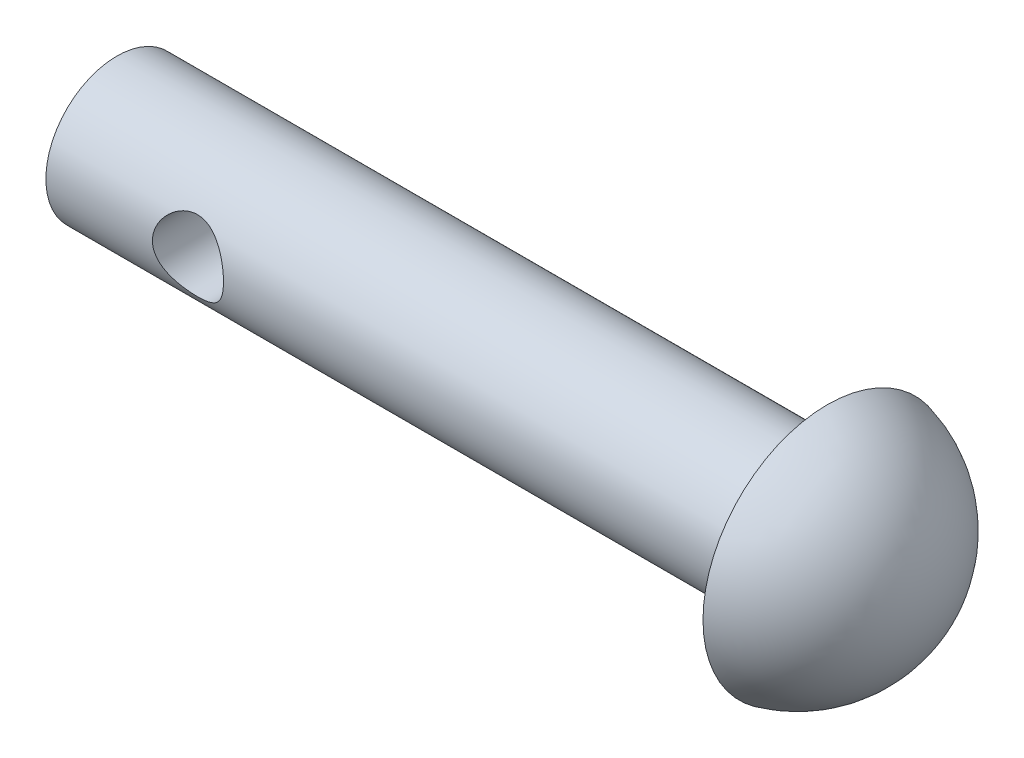
ISO-10303-21;
HEADER;
FILE_DESCRIPTION(('STEP AP214'),'2;1');
FILE_NAME('part.step','',(''),(''),'','','');
FILE_SCHEMA(('AUTOMOTIVE_DESIGN { 1 0 10303 214 1 1 1 1 }'));
ENDSEC;
DATA;
#1=APPLICATION_CONTEXT('core data for automotive mechanical design processes');
#2=APPLICATION_PROTOCOL_DEFINITION('international standard','automotive_design',2000,#1);
#3=PRODUCT_CONTEXT('',#1,'mechanical');
#4=PRODUCT('Part','Part','',(#3));
#5=PRODUCT_RELATED_PRODUCT_CATEGORY('part','',(#4));
#6=PRODUCT_DEFINITION_FORMATION('','',#4);
#7=PRODUCT_DEFINITION_CONTEXT('part definition',#1,'design');
#8=PRODUCT_DEFINITION('design','',#6,#7);
#9=PRODUCT_DEFINITION_SHAPE('','',#8);
#10=(LENGTH_UNIT() NAMED_UNIT(*) SI_UNIT(.MILLI.,.METRE.));
#11=(NAMED_UNIT(*) PLANE_ANGLE_UNIT() SI_UNIT($,.RADIAN.));
#12=(NAMED_UNIT(*) SI_UNIT($,.STERADIAN.) SOLID_ANGLE_UNIT());
#13=UNCERTAINTY_MEASURE_WITH_UNIT(LENGTH_MEASURE(1.E-05),#10,'distance_accuracy_value','');
#14=(GEOMETRIC_REPRESENTATION_CONTEXT(3) GLOBAL_UNCERTAINTY_ASSIGNED_CONTEXT((#13)) GLOBAL_UNIT_ASSIGNED_CONTEXT((#10,
#11,#12)) REPRESENTATION_CONTEXT('',''));
#15=CARTESIAN_POINT('',(0.,0.,0.));
#16=DIRECTION('',(0.,0.,1.));
#17=DIRECTION('',(1.,0.,0.));
#18=AXIS2_PLACEMENT_3D('',#15,#16,#17);
#19=CARTESIAN_POINT('',(-20.,0.,0.));
#20=DIRECTION('',(1.,0.,0.));
#21=DIRECTION('',(0.,0.,-1.));
#22=AXIS2_PLACEMENT_3D('',#19,#20,#21);
#23=CYLINDRICAL_SURFACE('',#22,2.);
#24=CARTESIAN_POINT('',(-15.,0.,-2.));
#25=CARTESIAN_POINT('',(-15.0000033023195,-0.0525719629529865,-1.99999713404151));
#26=CARTESIAN_POINT('',(-15.0041700731217,-0.105206599698033,-1.99790491019518));
#27=CARTESIAN_POINT('',(-15.0206528803409,-0.208920235268425,-1.98974156037396));
#28=CARTESIAN_POINT('',(-15.0329843929976,-0.259996086713504,-1.98366287828984));
#29=CARTESIAN_POINT('',(-15.0651938086168,-0.358933544880575,-1.96816279403312));
#30=CARTESIAN_POINT('',(-15.085042384248,-0.406806802939181,-1.9587543917752));
#31=CARTESIAN_POINT('',(-15.1315706213649,-0.498472616806566,-1.93745776515779));
#32=CARTESIAN_POINT('',(-15.1582497442489,-0.54226549399005,-1.9255697363353));
#33=CARTESIAN_POINT('',(-15.2195172494853,-0.62750781776192,-1.89956258258057));
#34=CARTESIAN_POINT('',(-15.2544864792396,-0.668655211122113,-1.88535199127536));
#35=CARTESIAN_POINT('',(-15.330521479247,-0.744779444866978,-1.85659970246744));
#36=CARTESIAN_POINT('',(-15.3715918517724,-0.779751583106767,-1.84205776209035));
#37=CARTESIAN_POINT('',(-15.4624833495234,-0.84525200045028,-1.81298951197347));
#38=CARTESIAN_POINT('',(-15.5127360983459,-0.875225335551638,-1.79855186970132));
#39=CARTESIAN_POINT('',(-15.6183673359862,-0.926168226890696,-1.77285978772321));
#40=CARTESIAN_POINT('',(-15.6737421287227,-0.947144214966335,-1.7616030760699));
#41=CARTESIAN_POINT('',(-15.7846651054219,-0.97813244218859,-1.74457867037808));
#42=CARTESIAN_POINT('',(-15.8400044520674,-0.988725857080443,-1.73852271583713));
#43=CARTESIAN_POINT('',(-15.9519788377795,-1.00042699330885,-1.73181889948528));
#44=CARTESIAN_POINT('',(-16.0086125408712,-1.00154408837308,-1.73116569343288));
#45=CARTESIAN_POINT('',(-16.1142860243154,-0.994687287172296,-1.73510930257248));
#46=CARTESIAN_POINT('',(-16.163424031223,-0.987784559536823,-1.73908763662013));
#47=CARTESIAN_POINT('',(-16.259721909373,-0.966939849056935,-1.7507622873385));
#48=CARTESIAN_POINT('',(-16.3068811453053,-0.952995623897654,-1.75845978831776));
#49=CARTESIAN_POINT('',(-16.3992291325657,-0.918209780386006,-1.77687476412741));
#50=CARTESIAN_POINT('',(-16.4443463987858,-0.897215067115997,-1.78765840663998));
#51=CARTESIAN_POINT('',(-16.53063429259,-0.849041687668004,-1.81103404281404));
#52=CARTESIAN_POINT('',(-16.5718031356001,-0.821860243812469,-1.8236268478019));
#53=CARTESIAN_POINT('',(-16.6545212527432,-0.75806605491279,-1.85113157903286));
#54=CARTESIAN_POINT('',(-16.6954568735762,-0.720694458369283,-1.86613510236746));
#55=CARTESIAN_POINT('',(-16.7707354185909,-0.639555578741374,-1.89547623300407));
#56=CARTESIAN_POINT('',(-16.8050751920339,-0.595785256574287,-1.90981351958801));
#57=CARTESIAN_POINT('',(-16.8676856610297,-0.50051650583185,-1.93701987282964));
#58=CARTESIAN_POINT('',(-16.8956004724457,-0.448753591599411,-1.94978984162007));
#59=CARTESIAN_POINT('',(-16.942097029043,-0.340466215488799,-1.97157881121242));
#60=CARTESIAN_POINT('',(-16.9606861850152,-0.283945576265279,-1.98060078943553));
#61=CARTESIAN_POINT('',(-16.9864754037167,-0.172766491660705,-1.99324333741436));
#62=CARTESIAN_POINT('',(-16.9944912357468,-0.118341530548327,-1.99724938301312));
#63=CARTESIAN_POINT('',(-17.0014647311345,-0.00877959994935651,-2.00073013459102));
#64=CARTESIAN_POINT('',(-17.0004266856395,0.0463570198698988,-2.00020698721312));
#65=CARTESIAN_POINT('',(-16.9897933115812,0.151232971985991,-1.99491192253441));
#66=CARTESIAN_POINT('',(-16.98086746727,0.201059408049952,-1.9904724568819));
#67=CARTESIAN_POINT('',(-16.9557619281049,0.298406892301915,-1.97822171314819));
#68=CARTESIAN_POINT('',(-16.9395814335466,0.345927685690995,-1.97041006334332));
#69=CARTESIAN_POINT('',(-16.9000015335668,0.438888608449664,-1.95184251413669));
#70=CARTESIAN_POINT('',(-16.8764089498832,0.484230397006153,-1.94100881769939));
#71=CARTESIAN_POINT('',(-16.822892464354,0.570461361698921,-1.91743974317109));
#72=CARTESIAN_POINT('',(-16.7929658654066,0.611348629775281,-1.90470355565785));
#73=CARTESIAN_POINT('',(-16.7242395746671,0.691767689290653,-1.87708221337464));
#74=CARTESIAN_POINT('',(-16.6848571315464,0.730772077824639,-1.86210884848441));
#75=CARTESIAN_POINT('',(-16.6000748487307,0.80185632111324,-1.83262391603874));
#76=CARTESIAN_POINT('',(-16.5546708811836,0.833931385690841,-1.81811267381526));
#77=CARTESIAN_POINT('',(-16.4563563457997,0.891707914497694,-1.79051192226068));
#78=CARTESIAN_POINT('',(-16.4031887337914,0.917025495878636,-1.77752529663472));
#79=CARTESIAN_POINT('',(-16.2924899323075,0.958082826013803,-1.75574072368126));
#80=CARTESIAN_POINT('',(-16.2349644734988,0.97383491588757,-1.74693738240618));
#81=CARTESIAN_POINT('',(-16.1230897771386,0.99386168744968,-1.73561501008667));
#82=CARTESIAN_POINT('',(-16.068965746571,0.999092996400866,-1.73257383460491));
#83=CARTESIAN_POINT('',(-15.9605529328293,1.00068915438079,-1.73165354646175));
#84=CARTESIAN_POINT('',(-15.9062642312606,0.997057846624401,-1.73377219627552));
#85=CARTESIAN_POINT('',(-15.804516498468,0.981926125592265,-1.74237862050025));
#86=CARTESIAN_POINT('',(-15.7568995298556,0.971208314342801,-1.74843094482394));
#87=CARTESIAN_POINT('',(-15.6641918805753,0.943175358224647,-1.76371016187917));
#88=CARTESIAN_POINT('',(-15.619102017908,0.925858091159812,-1.77293807569675));
#89=CARTESIAN_POINT('',(-15.5293751490134,0.883815745300685,-1.79428530364528));
#90=CARTESIAN_POINT('',(-15.4849720981703,0.85867113781646,-1.8065572239619));
#91=CARTESIAN_POINT('',(-15.4007254638194,0.802150971636636,-1.8323533163459));
#92=CARTESIAN_POINT('',(-15.3608842694815,0.77077217123865,-1.84587813794522));
#93=CARTESIAN_POINT('',(-15.2818580176424,0.698203326664643,-1.87462323159313));
#94=CARTESIAN_POINT('',(-15.2433408976381,0.656284423010173,-1.88984983311469));
#95=CARTESIAN_POINT('',(-15.1737370165764,0.566154806220281,-1.91877752255088));
#96=CARTESIAN_POINT('',(-15.1426542605737,0.517940723256786,-1.9324777860804));
#97=CARTESIAN_POINT('',(-15.0887636372378,0.415931596819949,-1.95698009585103));
#98=CARTESIAN_POINT('',(-15.0660158305886,0.362099503934616,-1.96776096562909));
#99=CARTESIAN_POINT('',(-15.030191832081,0.250742101294193,-1.98501341363465));
#100=CARTESIAN_POINT('',(-15.0170881531704,0.193227799623168,-1.99149723372932));
#101=CARTESIAN_POINT('',(-15.0061025889241,0.112601946483386,-1.99695461909663));
#102=CARTESIAN_POINT('',(-15.0038173591364,0.0901618794395003,-1.99809365339202));
#103=CARTESIAN_POINT('',(-15.0007653344832,0.0451517318071585,-1.99961696977865));
#104=CARTESIAN_POINT('',(-14.9999985815288,0.0225816476473818,-2.00000123103763));
#105=CARTESIAN_POINT('',(-15.,0.,-2.));
#106=B_SPLINE_CURVE_WITH_KNOTS('',3,(#24,#25,#26,#27,#28,#29,#30,#31,#32,#33,#34,#35,#36,#37,
#38,#39,#40,#41,#42,#43,#44,#45,#46,#47,#48,#49,#50,#51,#52,#53,#54,#55,#56,#57,#58,#59,#60,#61,
#62,#63,#64,#65,#66,#67,#68,#69,#70,#71,#72,#73,#74,#75,#76,#77,#78,#79,#80,#81,#82,#83,#84,#85,
#86,#87,#88,#89,#90,#91,#92,#93,#94,#95,#96,#97,#98,#99,#100,#101,#102,#103,#104,#105),
.UNSPECIFIED.,.T.,.F.,(4,2,2,2,2,2,2,2,2,2,2,2,2,2,2,2,2,2,2,2,2,2,2,2,2,2,2,2,2,2,2,2,2,2,2,2,
2,2,2,2,4),(0.,0.157624257420293,0.315548149709198,0.472862155492299,0.630163760581568,
0.79698175871809,0.963926237654036,1.14381726430753,1.32357947898281,1.4925801214023,
1.6614135732902,1.8100571240932,1.95874803925678,2.11090240168487,2.26312521260222,
2.43464941333879,2.60625534598687,2.78583022214441,2.9652621691228,3.12983290471346,
3.29432564511476,3.44606906506122,3.59782921630932,3.75392856027899,3.9100945074834,
4.08159610644419,4.25321588615432,4.43314682159674,4.61284511940778,4.77529307498374,
4.93767059860006,5.08457930244183,5.23153528783678,5.38836456775615,5.54527561138958,
5.72125242752499,5.89732383376573,6.07464013662926,6.25144908624931,6.31915280137698,
6.38685838514848),.UNSPECIFIED.);
#107=CARTESIAN_POINT('',(-15.,0.,-2.));
#108=VERTEX_POINT('',#107);
#109=EDGE_CURVE('E10',#108,#108,#106,.T.);
#110=ORIENTED_EDGE('',*,*,#109,.F.);
#111=EDGE_LOOP('',(#110));
#112=FACE_BOUND('',#111,.T.);
#113=CARTESIAN_POINT('',(-15.,0.,2.));
#114=CARTESIAN_POINT('',(-15.0000033023195,0.0525719629529865,1.99999713404151));
#115=CARTESIAN_POINT('',(-15.0041700731217,0.105206599698033,1.99790491019518));
#116=CARTESIAN_POINT('',(-15.0206528803409,0.208920235268425,1.98974156037396));
#117=CARTESIAN_POINT('',(-15.0329843929976,0.259996086713504,1.98366287828984));
#118=CARTESIAN_POINT('',(-15.0651938086168,0.358933544880575,1.96816279403312));
#119=CARTESIAN_POINT('',(-15.085042384248,0.406806802939181,1.9587543917752));
#120=CARTESIAN_POINT('',(-15.1315706213649,0.498472616806566,1.93745776515779));
#121=CARTESIAN_POINT('',(-15.1582497442489,0.54226549399005,1.9255697363353));
#122=CARTESIAN_POINT('',(-15.2195172494853,0.62750781776192,1.89956258258057));
#123=CARTESIAN_POINT('',(-15.2544864792396,0.668655211122113,1.88535199127536));
#124=CARTESIAN_POINT('',(-15.330521479247,0.744779444866978,1.85659970246744));
#125=CARTESIAN_POINT('',(-15.3715918517724,0.779751583106767,1.84205776209035));
#126=CARTESIAN_POINT('',(-15.4624833495234,0.84525200045028,1.81298951197347));
#127=CARTESIAN_POINT('',(-15.5127360983459,0.875225335551638,1.79855186970132));
#128=CARTESIAN_POINT('',(-15.6183673359862,0.926168226890696,1.77285978772321));
#129=CARTESIAN_POINT('',(-15.6737421287227,0.947144214966335,1.7616030760699));
#130=CARTESIAN_POINT('',(-15.7846651054219,0.97813244218859,1.74457867037808));
#131=CARTESIAN_POINT('',(-15.8400044520674,0.988725857080443,1.73852271583713));
#132=CARTESIAN_POINT('',(-15.9519788377795,1.00042699330885,1.73181889948528));
#133=CARTESIAN_POINT('',(-16.0086125408712,1.00154408837308,1.73116569343288));
#134=CARTESIAN_POINT('',(-16.1142860243154,0.994687287172296,1.73510930257248));
#135=CARTESIAN_POINT('',(-16.163424031223,0.987784559536823,1.73908763662013));
#136=CARTESIAN_POINT('',(-16.259721909373,0.966939849056935,1.7507622873385));
#137=CARTESIAN_POINT('',(-16.3068811453053,0.952995623897654,1.75845978831776));
#138=CARTESIAN_POINT('',(-16.3992291325657,0.918209780386006,1.77687476412741));
#139=CARTESIAN_POINT('',(-16.4443463987858,0.897215067115997,1.78765840663998));
#140=CARTESIAN_POINT('',(-16.53063429259,0.849041687668004,1.81103404281404));
#141=CARTESIAN_POINT('',(-16.5718031356001,0.821860243812469,1.8236268478019));
#142=CARTESIAN_POINT('',(-16.6545212527432,0.75806605491279,1.85113157903286));
#143=CARTESIAN_POINT('',(-16.6954568735762,0.720694458369283,1.86613510236746));
#144=CARTESIAN_POINT('',(-16.7707354185909,0.639555578741374,1.89547623300407));
#145=CARTESIAN_POINT('',(-16.8050751920339,0.595785256574287,1.90981351958801));
#146=CARTESIAN_POINT('',(-16.8676856610297,0.50051650583185,1.93701987282964));
#147=CARTESIAN_POINT('',(-16.8956004724457,0.448753591599411,1.94978984162007));
#148=CARTESIAN_POINT('',(-16.942097029043,0.340466215488799,1.97157881121242));
#149=CARTESIAN_POINT('',(-16.9606861850152,0.283945576265279,1.98060078943553));
#150=CARTESIAN_POINT('',(-16.9864754037167,0.172766491660705,1.99324333741436));
#151=CARTESIAN_POINT('',(-16.9944912357468,0.118341530548327,1.99724938301312));
#152=CARTESIAN_POINT('',(-17.0014647311345,0.00877959994935651,2.00073013459102));
#153=CARTESIAN_POINT('',(-17.0004266856395,-0.0463570198698988,2.00020698721312));
#154=CARTESIAN_POINT('',(-16.9897933115812,-0.151232971985991,1.99491192253441));
#155=CARTESIAN_POINT('',(-16.98086746727,-0.201059408049952,1.9904724568819));
#156=CARTESIAN_POINT('',(-16.9557619281049,-0.298406892301915,1.97822171314819));
#157=CARTESIAN_POINT('',(-16.9395814335466,-0.345927685690995,1.97041006334332));
#158=CARTESIAN_POINT('',(-16.9000015335668,-0.438888608449664,1.95184251413669));
#159=CARTESIAN_POINT('',(-16.8764089498832,-0.484230397006153,1.94100881769939));
#160=CARTESIAN_POINT('',(-16.822892464354,-0.570461361698921,1.91743974317109));
#161=CARTESIAN_POINT('',(-16.7929658654066,-0.611348629775281,1.90470355565785));
#162=CARTESIAN_POINT('',(-16.7242395746671,-0.691767689290653,1.87708221337464));
#163=CARTESIAN_POINT('',(-16.6848571315464,-0.730772077824639,1.86210884848441));
#164=CARTESIAN_POINT('',(-16.6000748487307,-0.80185632111324,1.83262391603874));
#165=CARTESIAN_POINT('',(-16.5546708811836,-0.833931385690841,1.81811267381526));
#166=CARTESIAN_POINT('',(-16.4563563457997,-0.891707914497694,1.79051192226068));
#167=CARTESIAN_POINT('',(-16.4031887337914,-0.917025495878636,1.77752529663472));
#168=CARTESIAN_POINT('',(-16.2924899323075,-0.958082826013803,1.75574072368126));
#169=CARTESIAN_POINT('',(-16.2349644734988,-0.97383491588757,1.74693738240618));
#170=CARTESIAN_POINT('',(-16.1230897771386,-0.99386168744968,1.73561501008667));
#171=CARTESIAN_POINT('',(-16.068965746571,-0.999092996400866,1.73257383460491));
#172=CARTESIAN_POINT('',(-15.9605529328293,-1.00068915438079,1.73165354646175));
#173=CARTESIAN_POINT('',(-15.9062642312606,-0.997057846624401,1.73377219627552));
#174=CARTESIAN_POINT('',(-15.804516498468,-0.981926125592265,1.74237862050025));
#175=CARTESIAN_POINT('',(-15.7568995298556,-0.971208314342801,1.74843094482394));
#176=CARTESIAN_POINT('',(-15.6641918805753,-0.943175358224647,1.76371016187917));
#177=CARTESIAN_POINT('',(-15.619102017908,-0.925858091159812,1.77293807569675));
#178=CARTESIAN_POINT('',(-15.5293751490134,-0.883815745300685,1.79428530364528));
#179=CARTESIAN_POINT('',(-15.4849720981703,-0.85867113781646,1.8065572239619));
#180=CARTESIAN_POINT('',(-15.4007254638194,-0.802150971636636,1.8323533163459));
#181=CARTESIAN_POINT('',(-15.3608842694815,-0.77077217123865,1.84587813794522));
#182=CARTESIAN_POINT('',(-15.2818580176424,-0.698203326664643,1.87462323159313));
#183=CARTESIAN_POINT('',(-15.2433408976381,-0.656284423010173,1.88984983311469));
#184=CARTESIAN_POINT('',(-15.1737370165764,-0.566154806220281,1.91877752255088));
#185=CARTESIAN_POINT('',(-15.1426542605737,-0.517940723256786,1.9324777860804));
#186=CARTESIAN_POINT('',(-15.0887636372378,-0.415931596819949,1.95698009585103));
#187=CARTESIAN_POINT('',(-15.0660158305886,-0.362099503934616,1.96776096562909));
#188=CARTESIAN_POINT('',(-15.030191832081,-0.250742101294193,1.98501341363465));
#189=CARTESIAN_POINT('',(-15.0170881531704,-0.193227799623168,1.99149723372932));
#190=CARTESIAN_POINT('',(-15.0061025889241,-0.112601946483386,1.99695461909663));
#191=CARTESIAN_POINT('',(-15.0038173591364,-0.0901618794395003,1.99809365339202));
#192=CARTESIAN_POINT('',(-15.0007653344832,-0.0451517318071585,1.99961696977865));
#193=CARTESIAN_POINT('',(-14.9999985815288,-0.0225816476473818,2.00000123103763));
#194=CARTESIAN_POINT('',(-15.,0.,2.));
#195=B_SPLINE_CURVE_WITH_KNOTS('',3,(#113,#114,#115,#116,#117,#118,#119,#120,#121,#122,#123,
#124,#125,#126,#127,#128,#129,#130,#131,#132,#133,#134,#135,#136,#137,#138,#139,#140,#141,#142,
#143,#144,#145,#146,#147,#148,#149,#150,#151,#152,#153,#154,#155,#156,#157,#158,#159,#160,#161,
#162,#163,#164,#165,#166,#167,#168,#169,#170,#171,#172,#173,#174,#175,#176,#177,#178,#179,#180,
#181,#182,#183,#184,#185,#186,#187,#188,#189,#190,#191,#192,#193,#194),.UNSPECIFIED.,.T.,.F.,(4,
2,2,2,2,2,2,2,2,2,2,2,2,2,2,2,2,2,2,2,2,2,2,2,2,2,2,2,2,2,2,2,2,2,2,2,2,2,2,2,4),(0.,
0.157624257420293,0.315548149709198,0.472862155492299,0.630163760581568,0.79698175871809,
0.963926237654036,1.14381726430753,1.32357947898281,1.4925801214023,1.6614135732902,
1.8100571240932,1.95874803925678,2.11090240168487,2.26312521260222,2.43464941333879,
2.60625534598687,2.78583022214441,2.9652621691228,3.12983290471346,3.29432564511476,
3.44606906506122,3.59782921630932,3.75392856027899,3.9100945074834,4.08159610644419,
4.25321588615432,4.43314682159674,4.61284511940778,4.77529307498374,4.93767059860006,
5.08457930244183,5.23153528783678,5.38836456775615,5.54527561138958,5.72125242752499,
5.89732383376573,6.07464013662926,6.25144908624931,6.31915280137698,6.38685838514848),.UNSPECIFIED.);
#196=CARTESIAN_POINT('',(-15.,0.,2.));
#197=VERTEX_POINT('',#196);
#198=EDGE_CURVE('E41',#197,#197,#195,.T.);
#199=ORIENTED_EDGE('',*,*,#198,.F.);
#200=EDGE_LOOP('',(#199));
#201=FACE_BOUND('',#200,.T.);
#202=CARTESIAN_POINT('',(-20.,0.,0.));
#203=DIRECTION('',(1.,0.,0.));
#204=DIRECTION('',(0.,0.,-1.));
#205=AXIS2_PLACEMENT_3D('',#202,#203,#204);
#206=CIRCLE('',#205,2.);
#207=CARTESIAN_POINT('',(-20.,0.,-2.));
#208=VERTEX_POINT('',#207);
#209=EDGE_CURVE('E45',#208,#208,#206,.T.);
#210=ORIENTED_EDGE('',*,*,#209,.T.);
#211=EDGE_LOOP('',(#210));
#212=FACE_BOUND('',#211,.T.);
#213=CARTESIAN_POINT('',(0.,0.,0.));
#214=DIRECTION('',(1.,0.,0.));
#215=DIRECTION('',(0.,0.,-1.));
#216=AXIS2_PLACEMENT_3D('',#213,#214,#215);
#217=CIRCLE('',#216,2.);
#218=CARTESIAN_POINT('',(0.,0.,-2.));
#219=VERTEX_POINT('',#218);
#220=EDGE_CURVE('E49',#219,#219,#217,.T.);
#221=ORIENTED_EDGE('',*,*,#220,.F.);
#222=EDGE_LOOP('',(#221));
#223=FACE_BOUND('',#222,.T.);
#224=ADVANCED_FACE('F30',(#112,#201,#212,#223),#23,.T.);
#225=CARTESIAN_POINT('',(-20.,0.,0.));
#226=DIRECTION('',(1.,0.,0.));
#227=DIRECTION('',(0.,0.,-1.));
#228=AXIS2_PLACEMENT_3D('',#225,#226,#227);
#229=PLANE('',#228);
#230=ORIENTED_EDGE('',*,*,#209,.F.);
#231=EDGE_LOOP('',(#230));
#232=FACE_BOUND('',#231,.T.);
#233=ADVANCED_FACE('F60',(#232),#229,.F.);
#234=CARTESIAN_POINT('',(-16.,0.,-2.));
#235=DIRECTION('',(0.,0.,1.));
#236=DIRECTION('',(1.,0.,0.));
#237=AXIS2_PLACEMENT_3D('',#234,#235,#236);
#238=CYLINDRICAL_SURFACE('',#237,1.);
#239=ORIENTED_EDGE('',*,*,#109,.T.);
#240=EDGE_LOOP('',(#239));
#241=FACE_BOUND('',#240,.T.);
#242=ORIENTED_EDGE('',*,*,#198,.T.);
#243=EDGE_LOOP('',(#242));
#244=FACE_BOUND('',#243,.T.);
#245=ADVANCED_FACE('F55',(#241,#244),#238,.F.);
#246=CARTESIAN_POINT('',(-0.842614977317635,0.,0.));
#247=DIRECTION('',(-1.,0.,0.));
#248=DIRECTION('',(0.,0.,-1.));
#249=AXIS2_PLACEMENT_3D('',#246,#247,#248);
#250=SPHERICAL_SURFACE('',#249,3.6);
#251=CARTESIAN_POINT('',(0.,0.,0.));
#252=DIRECTION('',(-1.,0.,0.));
#253=DIRECTION('',(0.,0.,1.));
#254=AXIS2_PLACEMENT_3D('',#251,#252,#253);
#255=CIRCLE('',#254,3.5);
#256=CARTESIAN_POINT('',(0.,0.,3.5));
#257=VERTEX_POINT('',#256);
#258=EDGE_CURVE('E75',#257,#257,#255,.T.);
#259=ORIENTED_EDGE('',*,*,#258,.F.);
#260=EDGE_LOOP('',(#259));
#261=FACE_BOUND('',#260,.T.);
#262=ADVANCED_FACE('F59',(#261),#250,.T.);
#263=CARTESIAN_POINT('',(0.,0.,0.));
#264=DIRECTION('',(1.,0.,0.));
#265=DIRECTION('',(0.,0.,-1.));
#266=AXIS2_PLACEMENT_3D('',#263,#264,#265);
#267=PLANE('',#266);
#268=ORIENTED_EDGE('',*,*,#220,.T.);
#269=EDGE_LOOP('',(#268));
#270=FACE_BOUND('',#269,.T.);
#271=ORIENTED_EDGE('',*,*,#258,.T.);
#272=EDGE_LOOP('',(#271));
#273=FACE_BOUND('',#272,.T.);
#274=ADVANCED_FACE('F80',(#270,#273),#267,.F.);
#275=CLOSED_SHELL('',(#224,#233,#245,#262,#274));
#276=MANIFOLD_SOLID_BREP('B2',#275);
#277=ADVANCED_BREP_SHAPE_REPRESENTATION('',(#18,#276),#14);
#278=SHAPE_DEFINITION_REPRESENTATION(#9,#277);
ENDSEC;
END-ISO-10303-21;
